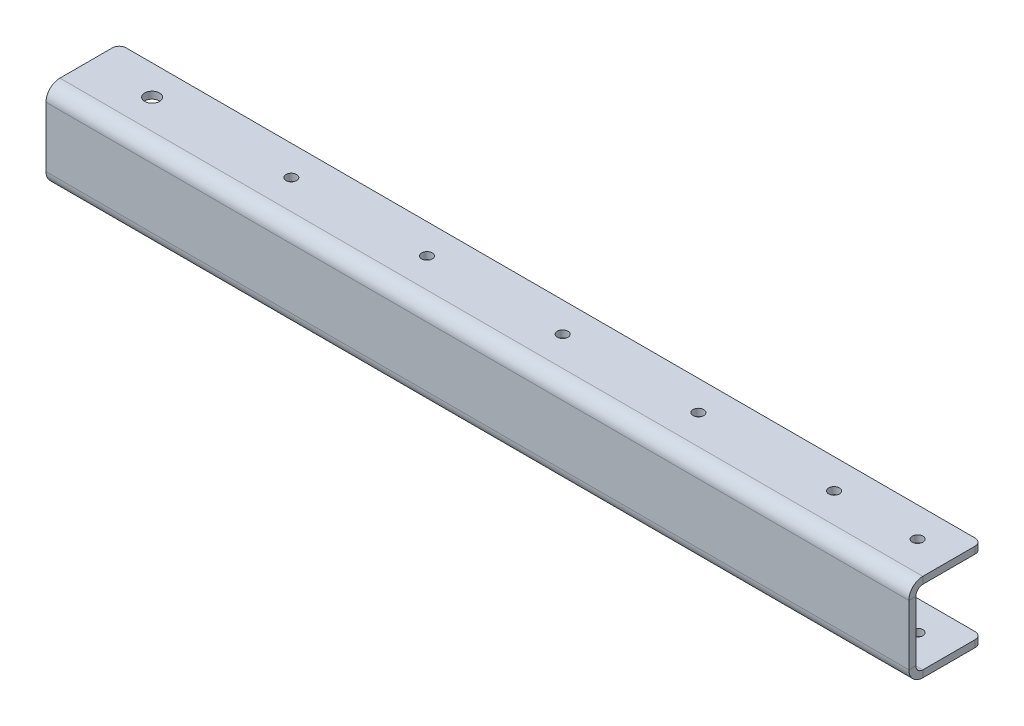
ISO-10303-21;
HEADER;
FILE_DESCRIPTION(('STEP AP214'),'2;1');
FILE_NAME('part.step','',(''),(''),'','','');
FILE_SCHEMA(('AUTOMOTIVE_DESIGN { 1 0 10303 214 1 1 1 1 }'));
ENDSEC;
DATA;
#1=APPLICATION_CONTEXT('core data for automotive mechanical design processes');
#2=APPLICATION_PROTOCOL_DEFINITION('international standard','automotive_design',2000,#1);
#3=PRODUCT_CONTEXT('',#1,'mechanical');
#4=PRODUCT('Part','Part','',(#3));
#5=PRODUCT_RELATED_PRODUCT_CATEGORY('part','',(#4));
#6=PRODUCT_DEFINITION_FORMATION('','',#4);
#7=PRODUCT_DEFINITION_CONTEXT('part definition',#1,'design');
#8=PRODUCT_DEFINITION('design','',#6,#7);
#9=PRODUCT_DEFINITION_SHAPE('','',#8);
#10=(LENGTH_UNIT() NAMED_UNIT(*) SI_UNIT(.MILLI.,.METRE.));
#11=(NAMED_UNIT(*) PLANE_ANGLE_UNIT() SI_UNIT($,.RADIAN.));
#12=(NAMED_UNIT(*) SI_UNIT($,.STERADIAN.) SOLID_ANGLE_UNIT());
#13=UNCERTAINTY_MEASURE_WITH_UNIT(LENGTH_MEASURE(1.E-05),#10,'distance_accuracy_value','');
#14=(GEOMETRIC_REPRESENTATION_CONTEXT(3) GLOBAL_UNCERTAINTY_ASSIGNED_CONTEXT((#13)) GLOBAL_UNIT_ASSIGNED_CONTEXT((#10,
#11,#12)) REPRESENTATION_CONTEXT('',''));
#15=CARTESIAN_POINT('',(0.,0.,0.));
#16=DIRECTION('',(0.,0.,1.));
#17=DIRECTION('',(1.,0.,0.));
#18=AXIS2_PLACEMENT_3D('',#15,#16,#17);
#19=CARTESIAN_POINT('',(393.7,0.,-3.175));
#20=DIRECTION('',(1.,0.,0.));
#21=DIRECTION('',(0.,0.,-1.));
#22=AXIS2_PLACEMENT_3D('',#19,#20,#21);
#23=PLANE('',#22);
#24=DIRECTION('',(0.,-1.,0.));
#25=VECTOR('',#24,1.);
#26=CARTESIAN_POINT('',(393.7,0.,-3.175));
#27=LINE('',#26,#25);
#28=CARTESIAN_POINT('',(393.7,0.,-3.175));
#29=VERTEX_POINT('',#28);
#30=CARTESIAN_POINT('',(393.7,-3.175,-3.175));
#31=VERTEX_POINT('',#30);
#32=EDGE_CURVE('E272',#29,#31,#27,.T.);
#33=ORIENTED_EDGE('',*,*,#32,.F.);
#34=CARTESIAN_POINT('',(393.7,3.175,-3.175));
#35=DIRECTION('',(1.,0.,0.));
#36=DIRECTION('',(0.,0.,-1.));
#37=AXIS2_PLACEMENT_3D('',#34,#35,#36);
#38=CIRCLE('',#37,3.175);
#39=CARTESIAN_POINT('',(393.7,3.175,0.));
#40=VERTEX_POINT('',#39);
#41=EDGE_CURVE('E201',#29,#40,#38,.F.);
#42=ORIENTED_EDGE('',*,*,#41,.T.);
#43=DIRECTION('',(0.,0.,-1.));
#44=VECTOR('',#43,1.);
#45=CARTESIAN_POINT('',(393.7,3.175,3.175));
#46=LINE('',#45,#44);
#47=CARTESIAN_POINT('',(393.7,3.175,3.175));
#48=VERTEX_POINT('',#47);
#49=EDGE_CURVE('E270',#48,#40,#46,.T.);
#50=ORIENTED_EDGE('',*,*,#49,.F.);
#51=CARTESIAN_POINT('',(393.7,3.175,-3.175));
#52=DIRECTION('',(1.,0.,0.));
#53=DIRECTION('',(0.,0.,-1.));
#54=AXIS2_PLACEMENT_3D('',#51,#52,#53);
#55=CIRCLE('',#54,6.35);
#56=EDGE_CURVE('E191',#31,#48,#55,.F.);
#57=ORIENTED_EDGE('',*,*,#56,.F.);
#58=EDGE_LOOP('',(#33,#42,#50,#57));
#59=FACE_BOUND('',#58,.T.);
#60=ADVANCED_FACE('F36',(#59),#23,.T.);
#61=CARTESIAN_POINT('',(393.7,3.175,3.175));
#62=DIRECTION('',(1.,0.,0.));
#63=DIRECTION('',(0.,0.,-1.));
#64=AXIS2_PLACEMENT_3D('',#61,#62,#63);
#65=PLANE('',#64);
#66=DIRECTION('',(0.,0.,-1.));
#67=VECTOR('',#66,1.);
#68=CARTESIAN_POINT('',(393.7,-3.175,0.));
#69=LINE('',#68,#67);
#70=CARTESIAN_POINT('',(393.7,-3.175,-27.051));
#71=VERTEX_POINT('',#70);
#72=EDGE_CURVE('E197',#71,#31,#69,.F.);
#73=ORIENTED_EDGE('',*,*,#72,.F.);
#74=DIRECTION('',(0.,-1.,0.));
#75=VECTOR('',#74,1.);
#76=CARTESIAN_POINT('',(393.7,3.175,-27.051));
#77=LINE('',#76,#75);
#78=CARTESIAN_POINT('',(393.7,0.,-27.051));
#79=VERTEX_POINT('',#78);
#80=EDGE_CURVE('E44',#71,#79,#77,.F.);
#81=ORIENTED_EDGE('',*,*,#80,.T.);
#82=DIRECTION('',(0.,0.,1.));
#83=VECTOR('',#82,1.);
#84=CARTESIAN_POINT('',(393.7,0.,0.));
#85=LINE('',#84,#83);
#86=EDGE_CURVE('E199',#79,#29,#85,.T.);
#87=ORIENTED_EDGE('',*,*,#86,.T.);
#88=ORIENTED_EDGE('',*,*,#32,.T.);
#89=EDGE_LOOP('',(#73,#81,#87,#88));
#90=FACE_BOUND('',#89,.T.);
#91=ADVANCED_FACE('F353',(#90),#65,.T.);
#92=CARTESIAN_POINT('',(0.,3.175,0.));
#93=DIRECTION('',(-1.,0.,0.));
#94=DIRECTION('',(0.,0.,1.));
#95=AXIS2_PLACEMENT_3D('',#92,#93,#94);
#96=PLANE('',#95);
#97=DIRECTION('',(0.,0.,1.));
#98=VECTOR('',#97,1.);
#99=CARTESIAN_POINT('',(0.,3.175,0.));
#100=LINE('',#99,#98);
#101=CARTESIAN_POINT('',(0.,3.175,0.));
#102=VERTEX_POINT('',#101);
#103=CARTESIAN_POINT('',(0.,3.175,3.175));
#104=VERTEX_POINT('',#103);
#105=EDGE_CURVE('E268',#102,#104,#100,.T.);
#106=ORIENTED_EDGE('',*,*,#105,.F.);
#107=CARTESIAN_POINT('',(0.,3.175,-3.175));
#108=DIRECTION('',(1.,0.,0.));
#109=DIRECTION('',(0.,0.,-1.));
#110=AXIS2_PLACEMENT_3D('',#107,#108,#109);
#111=CIRCLE('',#110,3.175);
#112=CARTESIAN_POINT('',(0.,0.,-3.175));
#113=VERTEX_POINT('',#112);
#114=EDGE_CURVE('E226',#113,#102,#111,.F.);
#115=ORIENTED_EDGE('',*,*,#114,.F.);
#116=DIRECTION('',(0.,1.,0.));
#117=VECTOR('',#116,1.);
#118=CARTESIAN_POINT('',(0.,-3.175,-3.175));
#119=LINE('',#118,#117);
#120=CARTESIAN_POINT('',(0.,-3.175,-3.175));
#121=VERTEX_POINT('',#120);
#122=EDGE_CURVE('E265',#121,#113,#119,.T.);
#123=ORIENTED_EDGE('',*,*,#122,.F.);
#124=CARTESIAN_POINT('',(0.,3.175,-3.175));
#125=DIRECTION('',(1.,0.,0.));
#126=DIRECTION('',(0.,0.,-1.));
#127=AXIS2_PLACEMENT_3D('',#124,#125,#126);
#128=CIRCLE('',#127,6.35);
#129=EDGE_CURVE('E219',#121,#104,#128,.F.);
#130=ORIENTED_EDGE('',*,*,#129,.T.);
#131=EDGE_LOOP('',(#106,#115,#123,#130));
#132=FACE_BOUND('',#131,.T.);
#133=ADVANCED_FACE('F490',(#132),#96,.T.);
#134=CARTESIAN_POINT('',(0.,-3.175,-3.175));
#135=DIRECTION('',(-1.,0.,0.));
#136=DIRECTION('',(0.,0.,1.));
#137=AXIS2_PLACEMENT_3D('',#134,#135,#136);
#138=PLANE('',#137);
#139=DIRECTION('',(0.,1.,0.));
#140=VECTOR('',#139,1.);
#141=CARTESIAN_POINT('',(0.,0.,0.));
#142=LINE('',#141,#140);
#143=CARTESIAN_POINT('',(0.,30.607,0.));
#144=VERTEX_POINT('',#143);
#145=EDGE_CURVE('E229',#102,#144,#142,.T.);
#146=ORIENTED_EDGE('',*,*,#145,.F.);
#147=ORIENTED_EDGE('',*,*,#105,.T.);
#148=DIRECTION('',(0.,1.,0.));
#149=VECTOR('',#148,1.);
#150=CARTESIAN_POINT('',(0.,0.,3.175));
#151=LINE('',#150,#149);
#152=CARTESIAN_POINT('',(0.,30.607,3.175));
#153=VERTEX_POINT('',#152);
#154=EDGE_CURVE('E216',#104,#153,#151,.T.);
#155=ORIENTED_EDGE('',*,*,#154,.T.);
#156=DIRECTION('',(0.,0.,-1.));
#157=VECTOR('',#156,1.);
#158=CARTESIAN_POINT('',(0.,30.607,3.175));
#159=LINE('',#158,#157);
#160=EDGE_CURVE('E261',#153,#144,#159,.T.);
#161=ORIENTED_EDGE('',*,*,#160,.T.);
#162=EDGE_LOOP('',(#146,#147,#155,#161));
#163=FACE_BOUND('',#162,.T.);
#164=ADVANCED_FACE('F518',(#163),#138,.T.);
#165=CARTESIAN_POINT('',(393.7,30.607,0.));
#166=DIRECTION('',(1.,0.,0.));
#167=DIRECTION('',(0.,0.,-1.));
#168=AXIS2_PLACEMENT_3D('',#165,#166,#167);
#169=PLANE('',#168);
#170=DIRECTION('',(0.,0.,1.));
#171=VECTOR('',#170,1.);
#172=CARTESIAN_POINT('',(393.7,30.607,0.));
#173=LINE('',#172,#171);
#174=CARTESIAN_POINT('',(393.7,30.607,0.));
#175=VERTEX_POINT('',#174);
#176=CARTESIAN_POINT('',(393.7,30.607,3.175));
#177=VERTEX_POINT('',#176);
#178=EDGE_CURVE('E162',#175,#177,#173,.T.);
#179=ORIENTED_EDGE('',*,*,#178,.F.);
#180=CARTESIAN_POINT('',(393.7,30.607,-3.175));
#181=DIRECTION('',(1.,0.,0.));
#182=DIRECTION('',(0.,0.,-1.));
#183=AXIS2_PLACEMENT_3D('',#180,#181,#182);
#184=CIRCLE('',#183,3.175);
#185=CARTESIAN_POINT('',(393.7,33.782,-3.175));
#186=VERTEX_POINT('',#185);
#187=EDGE_CURVE('E157',#175,#186,#184,.F.);
#188=ORIENTED_EDGE('',*,*,#187,.T.);
#189=DIRECTION('',(0.,-1.,0.));
#190=VECTOR('',#189,1.);
#191=CARTESIAN_POINT('',(393.7,36.957,-3.175));
#192=LINE('',#191,#190);
#193=CARTESIAN_POINT('',(393.7,36.957,-3.175));
#194=VERTEX_POINT('',#193);
#195=EDGE_CURVE('E150',#194,#186,#192,.T.);
#196=ORIENTED_EDGE('',*,*,#195,.F.);
#197=CARTESIAN_POINT('',(393.7,30.607,-3.175));
#198=DIRECTION('',(1.,0.,0.));
#199=DIRECTION('',(0.,0.,-1.));
#200=AXIS2_PLACEMENT_3D('',#197,#198,#199);
#201=CIRCLE('',#200,6.35);
#202=EDGE_CURVE('E154',#177,#194,#201,.F.);
#203=ORIENTED_EDGE('',*,*,#202,.F.);
#204=EDGE_LOOP('',(#179,#188,#196,#203));
#205=FACE_BOUND('',#204,.T.);
#206=ADVANCED_FACE('F152',(#205),#169,.T.);
#207=CARTESIAN_POINT('',(393.7,36.957,-3.175));
#208=DIRECTION('',(1.,0.,0.));
#209=DIRECTION('',(0.,0.,-1.));
#210=AXIS2_PLACEMENT_3D('',#207,#208,#209);
#211=PLANE('',#210);
#212=DIRECTION('',(0.,1.,0.));
#213=VECTOR('',#212,1.);
#214=CARTESIAN_POINT('',(393.7,0.,0.));
#215=LINE('',#214,#213);
#216=EDGE_CURVE('E204',#40,#175,#215,.T.);
#217=ORIENTED_EDGE('',*,*,#216,.T.);
#218=ORIENTED_EDGE('',*,*,#178,.T.);
#219=DIRECTION('',(0.,1.,0.));
#220=VECTOR('',#219,1.);
#221=CARTESIAN_POINT('',(393.7,0.,3.175));
#222=LINE('',#221,#220);
#223=EDGE_CURVE('E189',#48,#177,#222,.T.);
#224=ORIENTED_EDGE('',*,*,#223,.F.);
#225=ORIENTED_EDGE('',*,*,#49,.T.);
#226=EDGE_LOOP('',(#217,#218,#224,#225));
#227=FACE_BOUND('',#226,.T.);
#228=ADVANCED_FACE('F369',(#227),#211,.T.);
#229=CARTESIAN_POINT('',(0.,33.782,-3.175));
#230=DIRECTION('',(-1.,0.,0.));
#231=DIRECTION('',(0.,0.,1.));
#232=AXIS2_PLACEMENT_3D('',#229,#230,#231);
#233=PLANE('',#232);
#234=DIRECTION('',(0.,1.,0.));
#235=VECTOR('',#234,1.);
#236=CARTESIAN_POINT('',(0.,33.782,-3.175));
#237=LINE('',#236,#235);
#238=CARTESIAN_POINT('',(0.,33.782,-3.175));
#239=VERTEX_POINT('',#238);
#240=CARTESIAN_POINT('',(0.,36.957,-3.175));
#241=VERTEX_POINT('',#240);
#242=EDGE_CURVE('E163',#239,#241,#237,.T.);
#243=ORIENTED_EDGE('',*,*,#242,.F.);
#244=CARTESIAN_POINT('',(0.,30.607,-3.175));
#245=DIRECTION('',(1.,0.,0.));
#246=DIRECTION('',(0.,0.,-1.));
#247=AXIS2_PLACEMENT_3D('',#244,#245,#246);
#248=CIRCLE('',#247,3.175);
#249=EDGE_CURVE('E232',#144,#239,#248,.F.);
#250=ORIENTED_EDGE('',*,*,#249,.F.);
#251=ORIENTED_EDGE('',*,*,#160,.F.);
#252=CARTESIAN_POINT('',(0.,30.607,-3.175));
#253=DIRECTION('',(1.,0.,0.));
#254=DIRECTION('',(0.,0.,-1.));
#255=AXIS2_PLACEMENT_3D('',#252,#253,#254);
#256=CIRCLE('',#255,6.35);
#257=EDGE_CURVE('E214',#153,#241,#256,.F.);
#258=ORIENTED_EDGE('',*,*,#257,.T.);
#259=EDGE_LOOP('',(#243,#250,#251,#258));
#260=FACE_BOUND('',#259,.T.);
#261=ADVANCED_FACE('F516',(#260),#233,.T.);
#262=CARTESIAN_POINT('',(0.,30.607,3.175));
#263=DIRECTION('',(-1.,0.,0.));
#264=DIRECTION('',(0.,0.,1.));
#265=AXIS2_PLACEMENT_3D('',#262,#263,#264);
#266=PLANE('',#265);
#267=DIRECTION('',(0.,0.,-1.));
#268=VECTOR('',#267,1.);
#269=CARTESIAN_POINT('',(0.,36.957,0.));
#270=LINE('',#269,#268);
#271=CARTESIAN_POINT('',(0.,36.957,-27.051));
#272=VERTEX_POINT('',#271);
#273=EDGE_CURVE('E175',#241,#272,#270,.T.);
#274=ORIENTED_EDGE('',*,*,#273,.T.);
#275=DIRECTION('',(0.,-1.,0.));
#276=VECTOR('',#275,1.);
#277=CARTESIAN_POINT('',(0.,30.607,-27.051));
#278=LINE('',#277,#276);
#279=CARTESIAN_POINT('',(0.,33.782,-27.051));
#280=VERTEX_POINT('',#279);
#281=EDGE_CURVE('E275',#272,#280,#278,.T.);
#282=ORIENTED_EDGE('',*,*,#281,.T.);
#283=DIRECTION('',(0.,0.,-1.));
#284=VECTOR('',#283,1.);
#285=CARTESIAN_POINT('',(0.,33.782,0.));
#286=LINE('',#285,#284);
#287=EDGE_CURVE('E209',#239,#280,#286,.T.);
#288=ORIENTED_EDGE('',*,*,#287,.F.);
#289=ORIENTED_EDGE('',*,*,#242,.T.);
#290=EDGE_LOOP('',(#274,#282,#288,#289));
#291=FACE_BOUND('',#290,.T.);
#292=ADVANCED_FACE('F514',(#291),#266,.T.);
#293=CARTESIAN_POINT('',(393.7,33.782,0.));
#294=DIRECTION('',(0.,1.,0.));
#295=DIRECTION('',(0.,0.,1.));
#296=AXIS2_PLACEMENT_3D('',#293,#294,#295);
#297=PLANE('',#296);
#298=CARTESIAN_POINT('',(28.575,33.782,-16.66875));
#299=DIRECTION('',(0.,1.,0.));
#300=DIRECTION('',(0.,0.,1.));
#301=AXIS2_PLACEMENT_3D('',#298,#299,#300);
#302=CIRCLE('',#301,3.3782);
#303=CARTESIAN_POINT('',(28.575,33.782,-13.29055));
#304=VERTEX_POINT('',#303);
#305=EDGE_CURVE('E212',#304,#304,#302,.T.);
#306=ORIENTED_EDGE('',*,*,#305,.T.);
#307=EDGE_LOOP('',(#306));
#308=FACE_BOUND('',#307,.T.);
#309=CARTESIAN_POINT('',(277.8125,33.782,-16.66875));
#310=DIRECTION('',(0.,1.,0.));
#311=DIRECTION('',(0.,0.,1.));
#312=AXIS2_PLACEMENT_3D('',#309,#310,#311);
#313=CIRCLE('',#312,2.42569999999997);
#314=CARTESIAN_POINT('',(277.8125,33.782,-14.24305));
#315=VERTEX_POINT('',#314);
#316=EDGE_CURVE('E300',#315,#315,#313,.T.);
#317=ORIENTED_EDGE('',*,*,#316,.T.);
#318=EDGE_LOOP('',(#317));
#319=FACE_BOUND('',#318,.T.);
#320=CARTESIAN_POINT('',(215.9,33.782,-16.66875));
#321=DIRECTION('',(0.,1.,0.));
#322=DIRECTION('',(0.,0.,1.));
#323=AXIS2_PLACEMENT_3D('',#320,#321,#322);
#324=CIRCLE('',#323,2.4257);
#325=CARTESIAN_POINT('',(215.9,33.782,-14.24305));
#326=VERTEX_POINT('',#325);
#327=EDGE_CURVE('E296',#326,#326,#324,.T.);
#328=ORIENTED_EDGE('',*,*,#327,.T.);
#329=EDGE_LOOP('',(#328));
#330=FACE_BOUND('',#329,.T.);
#331=CARTESIAN_POINT('',(92.075,33.782,-16.66875));
#332=DIRECTION('',(0.,1.,0.));
#333=DIRECTION('',(0.,0.,1.));
#334=AXIS2_PLACEMENT_3D('',#331,#332,#333);
#335=CIRCLE('',#334,2.4257);
#336=CARTESIAN_POINT('',(92.075,33.782,-14.24305));
#337=VERTEX_POINT('',#336);
#338=EDGE_CURVE('E292',#337,#337,#335,.T.);
#339=ORIENTED_EDGE('',*,*,#338,.T.);
#340=EDGE_LOOP('',(#339));
#341=FACE_BOUND('',#340,.T.);
#342=CARTESIAN_POINT('',(339.725,33.782,-16.66875));
#343=DIRECTION('',(0.,1.,0.));
#344=DIRECTION('',(0.,0.,1.));
#345=AXIS2_PLACEMENT_3D('',#342,#343,#344);
#346=CIRCLE('',#345,2.42569999999997);
#347=CARTESIAN_POINT('',(339.725,33.782,-14.24305));
#348=VERTEX_POINT('',#347);
#349=EDGE_CURVE('E288',#348,#348,#346,.T.);
#350=ORIENTED_EDGE('',*,*,#349,.T.);
#351=EDGE_LOOP('',(#350));
#352=FACE_BOUND('',#351,.T.);
#353=CARTESIAN_POINT('',(377.825,33.782,-16.66875));
#354=DIRECTION('',(0.,1.,0.));
#355=DIRECTION('',(0.,0.,1.));
#356=AXIS2_PLACEMENT_3D('',#353,#354,#355);
#357=CIRCLE('',#356,2.42569999999997);
#358=CARTESIAN_POINT('',(377.825,33.782,-14.24305));
#359=VERTEX_POINT('',#358);
#360=EDGE_CURVE('E284',#359,#359,#357,.T.);
#361=ORIENTED_EDGE('',*,*,#360,.T.);
#362=EDGE_LOOP('',(#361));
#363=FACE_BOUND('',#362,.T.);
#364=CARTESIAN_POINT('',(153.9875,33.782,-16.66875));
#365=DIRECTION('',(0.,1.,0.));
#366=DIRECTION('',(0.,0.,1.));
#367=AXIS2_PLACEMENT_3D('',#364,#365,#366);
#368=CIRCLE('',#367,2.4257);
#369=CARTESIAN_POINT('',(153.9875,33.782,-14.24305));
#370=VERTEX_POINT('',#369);
#371=EDGE_CURVE('E279',#370,#370,#368,.T.);
#372=ORIENTED_EDGE('',*,*,#371,.T.);
#373=EDGE_LOOP('',(#372));
#374=FACE_BOUND('',#373,.T.);
#375=ORIENTED_EDGE('',*,*,#287,.T.);
#376=CARTESIAN_POINT('',(3.175,33.782,-27.051));
#377=DIRECTION('',(0.,1.,0.));
#378=DIRECTION('',(0.,0.,1.));
#379=AXIS2_PLACEMENT_3D('',#376,#377,#378);
#380=CIRCLE('',#379,3.175);
#381=CARTESIAN_POINT('',(3.17499999999998,33.782,-30.226));
#382=VERTEX_POINT('',#381);
#383=EDGE_CURVE('E308',#280,#382,#380,.F.);
#384=ORIENTED_EDGE('',*,*,#383,.T.);
#385=DIRECTION('',(-1.,0.,0.));
#386=VECTOR('',#385,1.);
#387=CARTESIAN_POINT('',(393.7,33.782,-30.226));
#388=LINE('',#387,#386);
#389=CARTESIAN_POINT('',(390.525,33.782,-30.226));
#390=VERTEX_POINT('',#389);
#391=EDGE_CURVE('E258',#390,#382,#388,.T.);
#392=ORIENTED_EDGE('',*,*,#391,.F.);
#393=CARTESIAN_POINT('',(390.525,33.782,-27.051));
#394=DIRECTION('',(0.,1.,0.));
#395=DIRECTION('',(0.,0.,1.));
#396=AXIS2_PLACEMENT_3D('',#393,#394,#395);
#397=CIRCLE('',#396,3.175);
#398=CARTESIAN_POINT('',(393.7,33.782,-27.051));
#399=VERTEX_POINT('',#398);
#400=EDGE_CURVE('E306',#390,#399,#397,.F.);
#401=ORIENTED_EDGE('',*,*,#400,.T.);
#402=DIRECTION('',(0.,0.,-1.));
#403=VECTOR('',#402,1.);
#404=CARTESIAN_POINT('',(393.7,33.782,0.));
#405=LINE('',#404,#403);
#406=EDGE_CURVE('E184',#186,#399,#405,.T.);
#407=ORIENTED_EDGE('',*,*,#406,.F.);
#408=DIRECTION('',(-1.,0.,0.));
#409=VECTOR('',#408,1.);
#410=CARTESIAN_POINT('',(393.7,33.782,-3.175));
#411=LINE('',#410,#409);
#412=EDGE_CURVE('E208',#186,#239,#411,.T.);
#413=ORIENTED_EDGE('',*,*,#412,.T.);
#414=EDGE_LOOP('',(#375,#384,#392,#401,#407,#413));
#415=FACE_BOUND('',#414,.T.);
#416=ADVANCED_FACE('F381',(#308,#319,#330,#341,#352,#363,#374,#415),#297,.F.);
#417=CARTESIAN_POINT('',(393.7,36.957,-30.226));
#418=DIRECTION('',(0.,0.,-1.));
#419=DIRECTION('',(-1.,0.,0.));
#420=AXIS2_PLACEMENT_3D('',#417,#418,#419);
#421=PLANE('',#420);
#422=ORIENTED_EDGE('',*,*,#391,.T.);
#423=DIRECTION('',(0.,-1.,0.));
#424=VECTOR('',#423,1.);
#425=CARTESIAN_POINT('',(3.17499999999998,36.957,-30.226));
#426=LINE('',#425,#424);
#427=CARTESIAN_POINT('',(3.17499999999998,36.957,-30.226));
#428=VERTEX_POINT('',#427);
#429=EDGE_CURVE('E313',#382,#428,#426,.F.);
#430=ORIENTED_EDGE('',*,*,#429,.T.);
#431=DIRECTION('',(-1.,0.,0.));
#432=VECTOR('',#431,1.);
#433=CARTESIAN_POINT('',(393.7,36.957,-30.226));
#434=LINE('',#433,#432);
#435=CARTESIAN_POINT('',(390.525,36.957,-30.226));
#436=VERTEX_POINT('',#435);
#437=EDGE_CURVE('E179',#436,#428,#434,.T.);
#438=ORIENTED_EDGE('',*,*,#437,.F.);
#439=DIRECTION('',(0.,-1.,0.));
#440=VECTOR('',#439,1.);
#441=CARTESIAN_POINT('',(390.525,36.957,-30.226));
#442=LINE('',#441,#440);
#443=EDGE_CURVE('E310',#436,#390,#442,.T.);
#444=ORIENTED_EDGE('',*,*,#443,.T.);
#445=EDGE_LOOP('',(#422,#430,#438,#444));
#446=FACE_BOUND('',#445,.T.);
#447=ADVANCED_FACE('F510',(#446),#421,.T.);
#448=CARTESIAN_POINT('',(393.7,36.957,0.));
#449=DIRECTION('',(0.,1.,0.));
#450=DIRECTION('',(0.,0.,1.));
#451=AXIS2_PLACEMENT_3D('',#448,#449,#450);
#452=PLANE('',#451);
#453=CARTESIAN_POINT('',(28.575,36.957,-16.66875));
#454=DIRECTION('',(0.,1.,0.));
#455=DIRECTION('',(0.,0.,1.));
#456=AXIS2_PLACEMENT_3D('',#453,#454,#455);
#457=CIRCLE('',#456,3.3782);
#458=CARTESIAN_POINT('',(28.575,36.957,-13.29055));
#459=VERTEX_POINT('',#458);
#460=EDGE_CURVE('E411',#459,#459,#457,.T.);
#461=ORIENTED_EDGE('',*,*,#460,.F.);
#462=EDGE_LOOP('',(#461));
#463=FACE_BOUND('',#462,.T.);
#464=CARTESIAN_POINT('',(277.8125,36.957,-16.66875));
#465=DIRECTION('',(0.,1.,0.));
#466=DIRECTION('',(0.,0.,1.));
#467=AXIS2_PLACEMENT_3D('',#464,#465,#466);
#468=CIRCLE('',#467,2.42569999999997);
#469=CARTESIAN_POINT('',(277.8125,36.957,-14.24305));
#470=VERTEX_POINT('',#469);
#471=EDGE_CURVE('E424',#470,#470,#468,.T.);
#472=ORIENTED_EDGE('',*,*,#471,.F.);
#473=EDGE_LOOP('',(#472));
#474=FACE_BOUND('',#473,.T.);
#475=CARTESIAN_POINT('',(215.9,36.957,-16.66875));
#476=DIRECTION('',(0.,1.,0.));
#477=DIRECTION('',(0.,0.,1.));
#478=AXIS2_PLACEMENT_3D('',#475,#476,#477);
#479=CIRCLE('',#478,2.4257);
#480=CARTESIAN_POINT('',(215.9,36.957,-14.24305));
#481=VERTEX_POINT('',#480);
#482=EDGE_CURVE('E430',#481,#481,#479,.T.);
#483=ORIENTED_EDGE('',*,*,#482,.F.);
#484=EDGE_LOOP('',(#483));
#485=FACE_BOUND('',#484,.T.);
#486=CARTESIAN_POINT('',(92.075,36.957,-16.66875));
#487=DIRECTION('',(0.,1.,0.));
#488=DIRECTION('',(0.,0.,1.));
#489=AXIS2_PLACEMENT_3D('',#486,#487,#488);
#490=CIRCLE('',#489,2.4257);
#491=CARTESIAN_POINT('',(92.075,36.957,-14.24305));
#492=VERTEX_POINT('',#491);
#493=EDGE_CURVE('E405',#492,#492,#490,.T.);
#494=ORIENTED_EDGE('',*,*,#493,.F.);
#495=EDGE_LOOP('',(#494));
#496=FACE_BOUND('',#495,.T.);
#497=CARTESIAN_POINT('',(339.725,36.957,-16.66875));
#498=DIRECTION('',(0.,1.,0.));
#499=DIRECTION('',(0.,0.,1.));
#500=AXIS2_PLACEMENT_3D('',#497,#498,#499);
#501=CIRCLE('',#500,2.42569999999997);
#502=CARTESIAN_POINT('',(339.725,36.957,-14.24305));
#503=VERTEX_POINT('',#502);
#504=EDGE_CURVE('E398',#503,#503,#501,.T.);
#505=ORIENTED_EDGE('',*,*,#504,.F.);
#506=EDGE_LOOP('',(#505));
#507=FACE_BOUND('',#506,.T.);
#508=CARTESIAN_POINT('',(377.825,36.957,-16.66875));
#509=DIRECTION('',(0.,1.,0.));
#510=DIRECTION('',(0.,0.,1.));
#511=AXIS2_PLACEMENT_3D('',#508,#509,#510);
#512=CIRCLE('',#511,2.42569999999997);
#513=CARTESIAN_POINT('',(377.825,36.957,-14.24305));
#514=VERTEX_POINT('',#513);
#515=EDGE_CURVE('E419',#514,#514,#512,.T.);
#516=ORIENTED_EDGE('',*,*,#515,.F.);
#517=EDGE_LOOP('',(#516));
#518=FACE_BOUND('',#517,.T.);
#519=CARTESIAN_POINT('',(153.9875,36.957,-16.66875));
#520=DIRECTION('',(0.,1.,0.));
#521=DIRECTION('',(0.,0.,1.));
#522=AXIS2_PLACEMENT_3D('',#519,#520,#521);
#523=CIRCLE('',#522,2.4257);
#524=CARTESIAN_POINT('',(153.9875,36.957,-14.24305));
#525=VERTEX_POINT('',#524);
#526=EDGE_CURVE('E412',#525,#525,#523,.T.);
#527=ORIENTED_EDGE('',*,*,#526,.F.);
#528=EDGE_LOOP('',(#527));
#529=FACE_BOUND('',#528,.T.);
#530=ORIENTED_EDGE('',*,*,#437,.T.);
#531=CARTESIAN_POINT('',(3.175,36.957,-27.051));
#532=DIRECTION('',(0.,1.,0.));
#533=DIRECTION('',(0.,0.,1.));
#534=AXIS2_PLACEMENT_3D('',#531,#532,#533);
#535=CIRCLE('',#534,3.175);
#536=EDGE_CURVE('E317',#428,#272,#535,.T.);
#537=ORIENTED_EDGE('',*,*,#536,.T.);
#538=ORIENTED_EDGE('',*,*,#273,.F.);
#539=DIRECTION('',(-1.,0.,0.));
#540=VECTOR('',#539,1.);
#541=CARTESIAN_POINT('',(393.7,36.957,-3.175));
#542=LINE('',#541,#540);
#543=EDGE_CURVE('E169',#194,#241,#542,.T.);
#544=ORIENTED_EDGE('',*,*,#543,.F.);
#545=DIRECTION('',(0.,0.,-1.));
#546=VECTOR('',#545,1.);
#547=CARTESIAN_POINT('',(393.7,36.957,0.));
#548=LINE('',#547,#546);
#549=CARTESIAN_POINT('',(393.7,36.957,-27.051));
#550=VERTEX_POINT('',#549);
#551=EDGE_CURVE('E172',#194,#550,#548,.T.);
#552=ORIENTED_EDGE('',*,*,#551,.T.);
#553=CARTESIAN_POINT('',(390.525,36.957,-27.051));
#554=DIRECTION('',(0.,1.,0.));
#555=DIRECTION('',(0.,0.,1.));
#556=AXIS2_PLACEMENT_3D('',#553,#554,#555);
#557=CIRCLE('',#556,3.175);
#558=EDGE_CURVE('E315',#550,#436,#557,.T.);
#559=ORIENTED_EDGE('',*,*,#558,.T.);
#560=EDGE_LOOP('',(#530,#537,#538,#544,#552,#559));
#561=FACE_BOUND('',#560,.T.);
#562=ADVANCED_FACE('F171',(#463,#474,#485,#496,#507,#518,#529,#561),#452,.T.);
#563=CARTESIAN_POINT('',(393.7,30.607,-3.175));
#564=DIRECTION('',(-1.,0.,0.));
#565=DIRECTION('',(0.,0.,1.));
#566=AXIS2_PLACEMENT_3D('',#563,#564,#565);
#567=CYLINDRICAL_SURFACE('',#566,6.35);
#568=ORIENTED_EDGE('',*,*,#257,.F.);
#569=DIRECTION('',(-1.,0.,0.));
#570=VECTOR('',#569,1.);
#571=CARTESIAN_POINT('',(393.7,30.607,3.175));
#572=LINE('',#571,#570);
#573=EDGE_CURVE('E180',#177,#153,#572,.T.);
#574=ORIENTED_EDGE('',*,*,#573,.F.);
#575=ORIENTED_EDGE('',*,*,#202,.T.);
#576=ORIENTED_EDGE('',*,*,#543,.T.);
#577=EDGE_LOOP('',(#568,#574,#575,#576));
#578=FACE_BOUND('',#577,.T.);
#579=ADVANCED_FACE('F187',(#578),#567,.T.);
#580=CARTESIAN_POINT('',(393.7,0.,3.175));
#581=DIRECTION('',(0.,0.,1.));
#582=DIRECTION('',(1.,0.,0.));
#583=AXIS2_PLACEMENT_3D('',#580,#581,#582);
#584=PLANE('',#583);
#585=ORIENTED_EDGE('',*,*,#154,.F.);
#586=DIRECTION('',(-1.,0.,0.));
#587=VECTOR('',#586,1.);
#588=CARTESIAN_POINT('',(393.7,3.175,3.175));
#589=LINE('',#588,#587);
#590=EDGE_CURVE('E253',#48,#104,#589,.T.);
#591=ORIENTED_EDGE('',*,*,#590,.F.);
#592=ORIENTED_EDGE('',*,*,#223,.T.);
#593=ORIENTED_EDGE('',*,*,#573,.T.);
#594=EDGE_LOOP('',(#585,#591,#592,#593));
#595=FACE_BOUND('',#594,.T.);
#596=ADVANCED_FACE('F368',(#595),#584,.T.);
#597=CARTESIAN_POINT('',(393.7,3.175,-3.175));
#598=DIRECTION('',(-1.,0.,0.));
#599=DIRECTION('',(0.,0.,1.));
#600=AXIS2_PLACEMENT_3D('',#597,#598,#599);
#601=CYLINDRICAL_SURFACE('',#600,6.35);
#602=ORIENTED_EDGE('',*,*,#129,.F.);
#603=DIRECTION('',(-1.,0.,0.));
#604=VECTOR('',#603,1.);
#605=CARTESIAN_POINT('',(393.7,-3.175,-3.175));
#606=LINE('',#605,#604);
#607=EDGE_CURVE('E250',#31,#121,#606,.T.);
#608=ORIENTED_EDGE('',*,*,#607,.F.);
#609=ORIENTED_EDGE('',*,*,#56,.T.);
#610=ORIENTED_EDGE('',*,*,#590,.T.);
#611=EDGE_LOOP('',(#602,#608,#609,#610));
#612=FACE_BOUND('',#611,.T.);
#613=ADVANCED_FACE('F360',(#612),#601,.T.);
#614=CARTESIAN_POINT('',(393.7,-3.175,0.));
#615=DIRECTION('',(0.,-1.,0.));
#616=DIRECTION('',(0.,0.,-1.));
#617=AXIS2_PLACEMENT_3D('',#614,#615,#616);
#618=PLANE('',#617);
#619=CARTESIAN_POINT('',(28.575,-3.175,-16.66875));
#620=DIRECTION('',(0.,1.,0.));
#621=DIRECTION('',(0.,0.,1.));
#622=AXIS2_PLACEMENT_3D('',#619,#620,#621);
#623=CIRCLE('',#622,3.3782);
#624=CARTESIAN_POINT('',(28.575,-3.175,-13.29055));
#625=VERTEX_POINT('',#624);
#626=EDGE_CURVE('E280',#625,#625,#623,.T.);
#627=ORIENTED_EDGE('',*,*,#626,.T.);
#628=EDGE_LOOP('',(#627));
#629=FACE_BOUND('',#628,.T.);
#630=CARTESIAN_POINT('',(277.8125,-3.175,-16.66875));
#631=DIRECTION('',(0.,1.,0.));
#632=DIRECTION('',(0.,0.,1.));
#633=AXIS2_PLACEMENT_3D('',#630,#631,#632);
#634=CIRCLE('',#633,2.42569999999997);
#635=CARTESIAN_POINT('',(277.8125,-3.175,-14.24305));
#636=VERTEX_POINT('',#635);
#637=EDGE_CURVE('E427',#636,#636,#634,.T.);
#638=ORIENTED_EDGE('',*,*,#637,.T.);
#639=EDGE_LOOP('',(#638));
#640=FACE_BOUND('',#639,.T.);
#641=CARTESIAN_POINT('',(215.9,-3.175,-16.66875));
#642=DIRECTION('',(0.,1.,0.));
#643=DIRECTION('',(0.,0.,1.));
#644=AXIS2_PLACEMENT_3D('',#641,#642,#643);
#645=CIRCLE('',#644,2.4257);
#646=CARTESIAN_POINT('',(215.9,-3.175,-14.24305));
#647=VERTEX_POINT('',#646);
#648=EDGE_CURVE('E416',#647,#647,#645,.T.);
#649=ORIENTED_EDGE('',*,*,#648,.T.);
#650=EDGE_LOOP('',(#649));
#651=FACE_BOUND('',#650,.T.);
#652=CARTESIAN_POINT('',(92.075,-3.175,-16.66875));
#653=DIRECTION('',(0.,1.,0.));
#654=DIRECTION('',(0.,0.,1.));
#655=AXIS2_PLACEMENT_3D('',#652,#653,#654);
#656=CIRCLE('',#655,2.4257);
#657=CARTESIAN_POINT('',(92.075,-3.175,-14.24305));
#658=VERTEX_POINT('',#657);
#659=EDGE_CURVE('E408',#658,#658,#656,.T.);
#660=ORIENTED_EDGE('',*,*,#659,.T.);
#661=EDGE_LOOP('',(#660));
#662=FACE_BOUND('',#661,.T.);
#663=CARTESIAN_POINT('',(339.725,-3.175,-16.66875));
#664=DIRECTION('',(0.,1.,0.));
#665=DIRECTION('',(0.,0.,1.));
#666=AXIS2_PLACEMENT_3D('',#663,#664,#665);
#667=CIRCLE('',#666,2.42569999999997);
#668=CARTESIAN_POINT('',(339.725,-3.175,-14.24305));
#669=VERTEX_POINT('',#668);
#670=EDGE_CURVE('E401',#669,#669,#667,.T.);
#671=ORIENTED_EDGE('',*,*,#670,.T.);
#672=EDGE_LOOP('',(#671));
#673=FACE_BOUND('',#672,.T.);
#674=CARTESIAN_POINT('',(377.825,-3.175,-16.66875));
#675=DIRECTION('',(0.,1.,0.));
#676=DIRECTION('',(0.,0.,1.));
#677=AXIS2_PLACEMENT_3D('',#674,#675,#676);
#678=CIRCLE('',#677,2.42569999999997);
#679=CARTESIAN_POINT('',(377.825,-3.175,-14.24305));
#680=VERTEX_POINT('',#679);
#681=EDGE_CURVE('E402',#680,#680,#678,.T.);
#682=ORIENTED_EDGE('',*,*,#681,.T.);
#683=EDGE_LOOP('',(#682));
#684=FACE_BOUND('',#683,.T.);
#685=CARTESIAN_POINT('',(153.9875,-3.175,-16.66875));
#686=DIRECTION('',(0.,1.,0.));
#687=DIRECTION('',(0.,0.,1.));
#688=AXIS2_PLACEMENT_3D('',#685,#686,#687);
#689=CIRCLE('',#688,2.4257);
#690=CARTESIAN_POINT('',(153.9875,-3.175,-14.24305));
#691=VERTEX_POINT('',#690);
#692=EDGE_CURVE('E415',#691,#691,#689,.T.);
#693=ORIENTED_EDGE('',*,*,#692,.T.);
#694=EDGE_LOOP('',(#693));
#695=FACE_BOUND('',#694,.T.);
#696=DIRECTION('',(0.,0.,-1.));
#697=VECTOR('',#696,1.);
#698=CARTESIAN_POINT('',(0.,-3.175,0.));
#699=LINE('',#698,#697);
#700=CARTESIAN_POINT('',(0.,-3.175,-27.051));
#701=VERTEX_POINT('',#700);
#702=EDGE_CURVE('E222',#701,#121,#699,.F.);
#703=ORIENTED_EDGE('',*,*,#702,.F.);
#704=CARTESIAN_POINT('',(3.175,-3.175,-27.051));
#705=DIRECTION('',(0.,-1.,0.));
#706=DIRECTION('',(0.,0.,-1.));
#707=AXIS2_PLACEMENT_3D('',#704,#705,#706);
#708=CIRCLE('',#707,3.175);
#709=CARTESIAN_POINT('',(3.17499999999998,-3.175,-30.226));
#710=VERTEX_POINT('',#709);
#711=EDGE_CURVE('E324',#701,#710,#708,.T.);
#712=ORIENTED_EDGE('',*,*,#711,.T.);
#713=DIRECTION('',(-1.,0.,0.));
#714=VECTOR('',#713,1.);
#715=CARTESIAN_POINT('',(393.7,-3.175,-30.226));
#716=LINE('',#715,#714);
#717=CARTESIAN_POINT('',(390.525,-3.175,-30.226));
#718=VERTEX_POINT('',#717);
#719=EDGE_CURVE('E248',#718,#710,#716,.T.);
#720=ORIENTED_EDGE('',*,*,#719,.F.);
#721=CARTESIAN_POINT('',(390.525,-3.175,-27.051));
#722=DIRECTION('',(0.,-1.,0.));
#723=DIRECTION('',(0.,0.,-1.));
#724=AXIS2_PLACEMENT_3D('',#721,#722,#723);
#725=CIRCLE('',#724,3.175);
#726=EDGE_CURVE('E322',#718,#71,#725,.T.);
#727=ORIENTED_EDGE('',*,*,#726,.T.);
#728=ORIENTED_EDGE('',*,*,#72,.T.);
#729=ORIENTED_EDGE('',*,*,#607,.T.);
#730=EDGE_LOOP('',(#703,#712,#720,#727,#728,#729));
#731=FACE_BOUND('',#730,.T.);
#732=ADVANCED_FACE('F347',(#629,#640,#651,#662,#673,#684,#695,#731),#618,.T.);
#733=CARTESIAN_POINT('',(393.7,0.,-30.226));
#734=DIRECTION('',(0.,0.,-1.));
#735=DIRECTION('',(-1.,0.,0.));
#736=AXIS2_PLACEMENT_3D('',#733,#734,#735);
#737=PLANE('',#736);
#738=ORIENTED_EDGE('',*,*,#719,.T.);
#739=DIRECTION('',(0.,-1.,0.));
#740=VECTOR('',#739,1.);
#741=CARTESIAN_POINT('',(3.175,0.,-30.226));
#742=LINE('',#741,#740);
#743=CARTESIAN_POINT('',(3.17499999999998,0.,-30.226));
#744=VERTEX_POINT('',#743);
#745=EDGE_CURVE('E58',#710,#744,#742,.F.);
#746=ORIENTED_EDGE('',*,*,#745,.T.);
#747=DIRECTION('',(-1.,0.,0.));
#748=VECTOR('',#747,1.);
#749=CARTESIAN_POINT('',(393.7,0.,-30.226));
#750=LINE('',#749,#748);
#751=CARTESIAN_POINT('',(390.525,0.,-30.226));
#752=VERTEX_POINT('',#751);
#753=EDGE_CURVE('E246',#752,#744,#750,.T.);
#754=ORIENTED_EDGE('',*,*,#753,.F.);
#755=DIRECTION('',(0.,-1.,0.));
#756=VECTOR('',#755,1.);
#757=CARTESIAN_POINT('',(390.525,0.,-30.226));
#758=LINE('',#757,#756);
#759=EDGE_CURVE('E326',#752,#718,#758,.T.);
#760=ORIENTED_EDGE('',*,*,#759,.T.);
#761=EDGE_LOOP('',(#738,#746,#754,#760));
#762=FACE_BOUND('',#761,.T.);
#763=ADVANCED_FACE('F348',(#762),#737,.T.);
#764=CARTESIAN_POINT('',(393.7,0.,0.));
#765=DIRECTION('',(0.,-1.,0.));
#766=DIRECTION('',(0.,0.,-1.));
#767=AXIS2_PLACEMENT_3D('',#764,#765,#766);
#768=PLANE('',#767);
#769=CARTESIAN_POINT('',(28.575,0.,-16.66875));
#770=DIRECTION('',(0.,-1.,0.));
#771=DIRECTION('',(0.,0.,-1.));
#772=AXIS2_PLACEMENT_3D('',#769,#770,#771);
#773=CIRCLE('',#772,3.3782);
#774=CARTESIAN_POINT('',(28.575,0.,-20.04695));
#775=VERTEX_POINT('',#774);
#776=EDGE_CURVE('E301',#775,#775,#773,.T.);
#777=ORIENTED_EDGE('',*,*,#776,.T.);
#778=EDGE_LOOP('',(#777));
#779=FACE_BOUND('',#778,.T.);
#780=CARTESIAN_POINT('',(277.8125,0.,-16.66875));
#781=DIRECTION('',(0.,-1.,0.));
#782=DIRECTION('',(0.,0.,-1.));
#783=AXIS2_PLACEMENT_3D('',#780,#781,#782);
#784=CIRCLE('',#783,2.42569999999997);
#785=CARTESIAN_POINT('',(277.8125,0.,-19.09445));
#786=VERTEX_POINT('',#785);
#787=EDGE_CURVE('E297',#786,#786,#784,.T.);
#788=ORIENTED_EDGE('',*,*,#787,.T.);
#789=EDGE_LOOP('',(#788));
#790=FACE_BOUND('',#789,.T.);
#791=CARTESIAN_POINT('',(215.9,0.,-16.66875));
#792=DIRECTION('',(0.,-1.,0.));
#793=DIRECTION('',(0.,0.,-1.));
#794=AXIS2_PLACEMENT_3D('',#791,#792,#793);
#795=CIRCLE('',#794,2.4257);
#796=CARTESIAN_POINT('',(215.9,0.,-19.09445));
#797=VERTEX_POINT('',#796);
#798=EDGE_CURVE('E293',#797,#797,#795,.T.);
#799=ORIENTED_EDGE('',*,*,#798,.T.);
#800=EDGE_LOOP('',(#799));
#801=FACE_BOUND('',#800,.T.);
#802=CARTESIAN_POINT('',(92.075,0.,-16.66875));
#803=DIRECTION('',(0.,-1.,0.));
#804=DIRECTION('',(0.,0.,-1.));
#805=AXIS2_PLACEMENT_3D('',#802,#803,#804);
#806=CIRCLE('',#805,2.4257);
#807=CARTESIAN_POINT('',(92.075,0.,-19.09445));
#808=VERTEX_POINT('',#807);
#809=EDGE_CURVE('E289',#808,#808,#806,.T.);
#810=ORIENTED_EDGE('',*,*,#809,.T.);
#811=EDGE_LOOP('',(#810));
#812=FACE_BOUND('',#811,.T.);
#813=CARTESIAN_POINT('',(339.725,0.,-16.66875));
#814=DIRECTION('',(0.,-1.,0.));
#815=DIRECTION('',(0.,0.,-1.));
#816=AXIS2_PLACEMENT_3D('',#813,#814,#815);
#817=CIRCLE('',#816,2.42569999999997);
#818=CARTESIAN_POINT('',(339.725,0.,-19.09445));
#819=VERTEX_POINT('',#818);
#820=EDGE_CURVE('E285',#819,#819,#817,.T.);
#821=ORIENTED_EDGE('',*,*,#820,.T.);
#822=EDGE_LOOP('',(#821));
#823=FACE_BOUND('',#822,.T.);
#824=CARTESIAN_POINT('',(377.825,0.,-16.66875));
#825=DIRECTION('',(0.,-1.,0.));
#826=DIRECTION('',(0.,0.,-1.));
#827=AXIS2_PLACEMENT_3D('',#824,#825,#826);
#828=CIRCLE('',#827,2.42569999999997);
#829=CARTESIAN_POINT('',(377.825,0.,-19.09445));
#830=VERTEX_POINT('',#829);
#831=EDGE_CURVE('E281',#830,#830,#828,.T.);
#832=ORIENTED_EDGE('',*,*,#831,.T.);
#833=EDGE_LOOP('',(#832));
#834=FACE_BOUND('',#833,.T.);
#835=CARTESIAN_POINT('',(153.9875,0.,-16.66875));
#836=DIRECTION('',(0.,-1.,0.));
#837=DIRECTION('',(0.,0.,-1.));
#838=AXIS2_PLACEMENT_3D('',#835,#836,#837);
#839=CIRCLE('',#838,2.4257);
#840=CARTESIAN_POINT('',(153.9875,0.,-19.09445));
#841=VERTEX_POINT('',#840);
#842=EDGE_CURVE('E276',#841,#841,#839,.T.);
#843=ORIENTED_EDGE('',*,*,#842,.T.);
#844=EDGE_LOOP('',(#843));
#845=FACE_BOUND('',#844,.T.);
#846=ORIENTED_EDGE('',*,*,#753,.T.);
#847=CARTESIAN_POINT('',(3.175,0.,-27.051));
#848=DIRECTION('',(0.,-1.,0.));
#849=DIRECTION('',(0.,0.,-1.));
#850=AXIS2_PLACEMENT_3D('',#847,#848,#849);
#851=CIRCLE('',#850,3.175);
#852=CARTESIAN_POINT('',(0.,0.,-27.051));
#853=VERTEX_POINT('',#852);
#854=EDGE_CURVE('E332',#744,#853,#851,.F.);
#855=ORIENTED_EDGE('',*,*,#854,.T.);
#856=DIRECTION('',(0.,0.,1.));
#857=VECTOR('',#856,1.);
#858=CARTESIAN_POINT('',(0.,0.,0.));
#859=LINE('',#858,#857);
#860=EDGE_CURVE('E224',#853,#113,#859,.T.);
#861=ORIENTED_EDGE('',*,*,#860,.T.);
#862=DIRECTION('',(-1.,0.,0.));
#863=VECTOR('',#862,1.);
#864=CARTESIAN_POINT('',(393.7,0.,-3.175));
#865=LINE('',#864,#863);
#866=EDGE_CURVE('E243',#29,#113,#865,.T.);
#867=ORIENTED_EDGE('',*,*,#866,.F.);
#868=ORIENTED_EDGE('',*,*,#86,.F.);
#869=CARTESIAN_POINT('',(390.525,0.,-27.051));
#870=DIRECTION('',(0.,-1.,0.));
#871=DIRECTION('',(0.,0.,-1.));
#872=AXIS2_PLACEMENT_3D('',#869,#870,#871);
#873=CIRCLE('',#872,3.175);
#874=EDGE_CURVE('E330',#79,#752,#873,.F.);
#875=ORIENTED_EDGE('',*,*,#874,.T.);
#876=EDGE_LOOP('',(#846,#855,#861,#867,#868,#875));
#877=FACE_BOUND('',#876,.T.);
#878=ADVANCED_FACE('F336',(#779,#790,#801,#812,#823,#834,#845,#877),#768,.F.);
#879=CARTESIAN_POINT('',(393.7,3.175,-3.175));
#880=DIRECTION('',(-1.,0.,0.));
#881=DIRECTION('',(0.,0.,1.));
#882=AXIS2_PLACEMENT_3D('',#879,#880,#881);
#883=CYLINDRICAL_SURFACE('',#882,3.175);
#884=ORIENTED_EDGE('',*,*,#114,.T.);
#885=DIRECTION('',(-1.,0.,0.));
#886=VECTOR('',#885,1.);
#887=CARTESIAN_POINT('',(393.7,3.175,0.));
#888=LINE('',#887,#886);
#889=EDGE_CURVE('E240',#40,#102,#888,.T.);
#890=ORIENTED_EDGE('',*,*,#889,.F.);
#891=ORIENTED_EDGE('',*,*,#41,.F.);
#892=ORIENTED_EDGE('',*,*,#866,.T.);
#893=EDGE_LOOP('',(#884,#890,#891,#892));
#894=FACE_BOUND('',#893,.T.);
#895=ADVANCED_FACE('F453',(#894),#883,.F.);
#896=CARTESIAN_POINT('',(393.7,0.,0.));
#897=DIRECTION('',(0.,0.,1.));
#898=DIRECTION('',(1.,0.,0.));
#899=AXIS2_PLACEMENT_3D('',#896,#897,#898);
#900=PLANE('',#899);
#901=ORIENTED_EDGE('',*,*,#145,.T.);
#902=DIRECTION('',(-1.,0.,0.));
#903=VECTOR('',#902,1.);
#904=CARTESIAN_POINT('',(393.7,30.607,0.));
#905=LINE('',#904,#903);
#906=EDGE_CURVE('E237',#175,#144,#905,.T.);
#907=ORIENTED_EDGE('',*,*,#906,.F.);
#908=ORIENTED_EDGE('',*,*,#216,.F.);
#909=ORIENTED_EDGE('',*,*,#889,.T.);
#910=EDGE_LOOP('',(#901,#907,#908,#909));
#911=FACE_BOUND('',#910,.T.);
#912=ADVANCED_FACE('F373',(#911),#900,.F.);
#913=CARTESIAN_POINT('',(393.7,30.607,-3.175));
#914=DIRECTION('',(-1.,0.,0.));
#915=DIRECTION('',(0.,0.,1.));
#916=AXIS2_PLACEMENT_3D('',#913,#914,#915);
#917=CYLINDRICAL_SURFACE('',#916,3.175);
#918=ORIENTED_EDGE('',*,*,#249,.T.);
#919=ORIENTED_EDGE('',*,*,#412,.F.);
#920=ORIENTED_EDGE('',*,*,#187,.F.);
#921=ORIENTED_EDGE('',*,*,#906,.T.);
#922=EDGE_LOOP('',(#918,#919,#920,#921));
#923=FACE_BOUND('',#922,.T.);
#924=ADVANCED_FACE('F377',(#923),#917,.F.);
#925=CARTESIAN_POINT('',(393.7,30.607,-3.175));
#926=DIRECTION('',(1.,0.,0.));
#927=DIRECTION('',(0.,0.,-1.));
#928=AXIS2_PLACEMENT_3D('',#925,#926,#927);
#929=PLANE('',#928);
#930=ORIENTED_EDGE('',*,*,#406,.T.);
#931=DIRECTION('',(0.,-1.,0.));
#932=VECTOR('',#931,1.);
#933=CARTESIAN_POINT('',(393.7,30.607,-27.051));
#934=LINE('',#933,#932);
#935=EDGE_CURVE('E11',#399,#550,#934,.F.);
#936=ORIENTED_EDGE('',*,*,#935,.T.);
#937=ORIENTED_EDGE('',*,*,#551,.F.);
#938=ORIENTED_EDGE('',*,*,#195,.T.);
#939=EDGE_LOOP('',(#930,#936,#937,#938));
#940=FACE_BOUND('',#939,.T.);
#941=ADVANCED_FACE('F182',(#940),#929,.T.);
#942=CARTESIAN_POINT('',(0.,30.607,-3.175));
#943=DIRECTION('',(1.,0.,0.));
#944=DIRECTION('',(0.,0.,-1.));
#945=AXIS2_PLACEMENT_3D('',#942,#943,#944);
#946=PLANE('',#945);
#947=ORIENTED_EDGE('',*,*,#860,.F.);
#948=DIRECTION('',(0.,-1.,0.));
#949=VECTOR('',#948,1.);
#950=CARTESIAN_POINT('',(0.,-3.175,-27.051));
#951=LINE('',#950,#949);
#952=EDGE_CURVE('E319',#853,#701,#951,.T.);
#953=ORIENTED_EDGE('',*,*,#952,.T.);
#954=ORIENTED_EDGE('',*,*,#702,.T.);
#955=ORIENTED_EDGE('',*,*,#122,.T.);
#956=EDGE_LOOP('',(#947,#953,#954,#955));
#957=FACE_BOUND('',#956,.T.);
#958=ADVANCED_FACE('F341',(#957),#946,.F.);
#959=CARTESIAN_POINT('',(153.9875,-3.175,-16.66875));
#960=DIRECTION('',(0.,1.,0.));
#961=DIRECTION('',(0.,0.,1.));
#962=AXIS2_PLACEMENT_3D('',#959,#960,#961);
#963=CYLINDRICAL_SURFACE('',#962,2.4257);
#964=ORIENTED_EDGE('',*,*,#692,.F.);
#965=EDGE_LOOP('',(#964));
#966=FACE_BOUND('',#965,.T.);
#967=ORIENTED_EDGE('',*,*,#842,.F.);
#968=EDGE_LOOP('',(#967));
#969=FACE_BOUND('',#968,.T.);
#970=ADVANCED_FACE('F467',(#966,#969),#963,.F.);
#971=CARTESIAN_POINT('',(377.825,-3.175,-16.66875));
#972=DIRECTION('',(0.,1.,0.));
#973=DIRECTION('',(0.,0.,1.));
#974=AXIS2_PLACEMENT_3D('',#971,#972,#973);
#975=CYLINDRICAL_SURFACE('',#974,2.42569999999997);
#976=ORIENTED_EDGE('',*,*,#681,.F.);
#977=EDGE_LOOP('',(#976));
#978=FACE_BOUND('',#977,.T.);
#979=ORIENTED_EDGE('',*,*,#831,.F.);
#980=EDGE_LOOP('',(#979));
#981=FACE_BOUND('',#980,.T.);
#982=ADVANCED_FACE('F469',(#978,#981),#975,.F.);
#983=CARTESIAN_POINT('',(339.725,-3.175,-16.66875));
#984=DIRECTION('',(0.,1.,0.));
#985=DIRECTION('',(0.,0.,1.));
#986=AXIS2_PLACEMENT_3D('',#983,#984,#985);
#987=CYLINDRICAL_SURFACE('',#986,2.42569999999997);
#988=ORIENTED_EDGE('',*,*,#670,.F.);
#989=EDGE_LOOP('',(#988));
#990=FACE_BOUND('',#989,.T.);
#991=ORIENTED_EDGE('',*,*,#820,.F.);
#992=EDGE_LOOP('',(#991));
#993=FACE_BOUND('',#992,.T.);
#994=ADVANCED_FACE('F476',(#990,#993),#987,.F.);
#995=CARTESIAN_POINT('',(92.075,-3.175,-16.66875));
#996=DIRECTION('',(0.,1.,0.));
#997=DIRECTION('',(0.,0.,1.));
#998=AXIS2_PLACEMENT_3D('',#995,#996,#997);
#999=CYLINDRICAL_SURFACE('',#998,2.4257);
#1000=ORIENTED_EDGE('',*,*,#659,.F.);
#1001=EDGE_LOOP('',(#1000));
#1002=FACE_BOUND('',#1001,.T.);
#1003=ORIENTED_EDGE('',*,*,#809,.F.);
#1004=EDGE_LOOP('',(#1003));
#1005=FACE_BOUND('',#1004,.T.);
#1006=ADVANCED_FACE('F693',(#1002,#1005),#999,.F.);
#1007=CARTESIAN_POINT('',(215.9,-3.175,-16.66875));
#1008=DIRECTION('',(0.,1.,0.));
#1009=DIRECTION('',(0.,0.,1.));
#1010=AXIS2_PLACEMENT_3D('',#1007,#1008,#1009);
#1011=CYLINDRICAL_SURFACE('',#1010,2.4257);
#1012=ORIENTED_EDGE('',*,*,#648,.F.);
#1013=EDGE_LOOP('',(#1012));
#1014=FACE_BOUND('',#1013,.T.);
#1015=ORIENTED_EDGE('',*,*,#798,.F.);
#1016=EDGE_LOOP('',(#1015));
#1017=FACE_BOUND('',#1016,.T.);
#1018=ADVANCED_FACE('F685',(#1014,#1017),#1011,.F.);
#1019=CARTESIAN_POINT('',(277.8125,-3.175,-16.66875));
#1020=DIRECTION('',(0.,1.,0.));
#1021=DIRECTION('',(0.,0.,1.));
#1022=AXIS2_PLACEMENT_3D('',#1019,#1020,#1021);
#1023=CYLINDRICAL_SURFACE('',#1022,2.42569999999997);
#1024=ORIENTED_EDGE('',*,*,#637,.F.);
#1025=EDGE_LOOP('',(#1024));
#1026=FACE_BOUND('',#1025,.T.);
#1027=ORIENTED_EDGE('',*,*,#787,.F.);
#1028=EDGE_LOOP('',(#1027));
#1029=FACE_BOUND('',#1028,.T.);
#1030=ADVANCED_FACE('F446',(#1026,#1029),#1023,.F.);
#1031=CARTESIAN_POINT('',(28.575,-3.175,-16.66875));
#1032=DIRECTION('',(0.,1.,0.));
#1033=DIRECTION('',(0.,0.,1.));
#1034=AXIS2_PLACEMENT_3D('',#1031,#1032,#1033);
#1035=CYLINDRICAL_SURFACE('',#1034,3.3782);
#1036=ORIENTED_EDGE('',*,*,#626,.F.);
#1037=EDGE_LOOP('',(#1036));
#1038=FACE_BOUND('',#1037,.T.);
#1039=ORIENTED_EDGE('',*,*,#776,.F.);
#1040=EDGE_LOOP('',(#1039));
#1041=FACE_BOUND('',#1040,.T.);
#1042=ADVANCED_FACE('F442',(#1038,#1041),#1035,.F.);
#1043=ORIENTED_EDGE('',*,*,#526,.T.);
#1044=EDGE_LOOP('',(#1043));
#1045=FACE_BOUND('',#1044,.T.);
#1046=ORIENTED_EDGE('',*,*,#371,.F.);
#1047=EDGE_LOOP('',(#1046));
#1048=FACE_BOUND('',#1047,.T.);
#1049=ADVANCED_FACE('F445',(#1045,#1048),#963,.F.);
#1050=ORIENTED_EDGE('',*,*,#515,.T.);
#1051=EDGE_LOOP('',(#1050));
#1052=FACE_BOUND('',#1051,.T.);
#1053=ORIENTED_EDGE('',*,*,#360,.F.);
#1054=EDGE_LOOP('',(#1053));
#1055=FACE_BOUND('',#1054,.T.);
#1056=ADVANCED_FACE('F479',(#1052,#1055),#975,.F.);
#1057=ORIENTED_EDGE('',*,*,#504,.T.);
#1058=EDGE_LOOP('',(#1057));
#1059=FACE_BOUND('',#1058,.T.);
#1060=ORIENTED_EDGE('',*,*,#349,.F.);
#1061=EDGE_LOOP('',(#1060));
#1062=FACE_BOUND('',#1061,.T.);
#1063=ADVANCED_FACE('F691',(#1059,#1062),#987,.F.);
#1064=ORIENTED_EDGE('',*,*,#493,.T.);
#1065=EDGE_LOOP('',(#1064));
#1066=FACE_BOUND('',#1065,.T.);
#1067=ORIENTED_EDGE('',*,*,#338,.F.);
#1068=EDGE_LOOP('',(#1067));
#1069=FACE_BOUND('',#1068,.T.);
#1070=ADVANCED_FACE('F682',(#1066,#1069),#999,.F.);
#1071=ORIENTED_EDGE('',*,*,#482,.T.);
#1072=EDGE_LOOP('',(#1071));
#1073=FACE_BOUND('',#1072,.T.);
#1074=ORIENTED_EDGE('',*,*,#327,.F.);
#1075=EDGE_LOOP('',(#1074));
#1076=FACE_BOUND('',#1075,.T.);
#1077=ADVANCED_FACE('F674',(#1073,#1076),#1011,.F.);
#1078=ORIENTED_EDGE('',*,*,#471,.T.);
#1079=EDGE_LOOP('',(#1078));
#1080=FACE_BOUND('',#1079,.T.);
#1081=ORIENTED_EDGE('',*,*,#316,.F.);
#1082=EDGE_LOOP('',(#1081));
#1083=FACE_BOUND('',#1082,.T.);
#1084=ADVANCED_FACE('F668',(#1080,#1083),#1023,.F.);
#1085=ORIENTED_EDGE('',*,*,#460,.T.);
#1086=EDGE_LOOP('',(#1085));
#1087=FACE_BOUND('',#1086,.T.);
#1088=ORIENTED_EDGE('',*,*,#305,.F.);
#1089=EDGE_LOOP('',(#1088));
#1090=FACE_BOUND('',#1089,.T.);
#1091=ADVANCED_FACE('F448',(#1087,#1090),#1035,.F.);
#1092=CARTESIAN_POINT('',(3.175,30.607,-27.051));
#1093=DIRECTION('',(0.,-1.,0.));
#1094=DIRECTION('',(0.,0.,-1.));
#1095=AXIS2_PLACEMENT_3D('',#1092,#1093,#1094);
#1096=CYLINDRICAL_SURFACE('',#1095,3.175);
#1097=ORIENTED_EDGE('',*,*,#536,.F.);
#1098=ORIENTED_EDGE('',*,*,#429,.F.);
#1099=ORIENTED_EDGE('',*,*,#383,.F.);
#1100=ORIENTED_EDGE('',*,*,#281,.F.);
#1101=EDGE_LOOP('',(#1097,#1098,#1099,#1100));
#1102=FACE_BOUND('',#1101,.T.);
#1103=ADVANCED_FACE('F494',(#1102),#1096,.T.);
#1104=CARTESIAN_POINT('',(3.175,30.607,-27.051));
#1105=DIRECTION('',(0.,1.,0.));
#1106=DIRECTION('',(0.,0.,1.));
#1107=AXIS2_PLACEMENT_3D('',#1104,#1105,#1106);
#1108=CYLINDRICAL_SURFACE('',#1107,3.175);
#1109=ORIENTED_EDGE('',*,*,#854,.F.);
#1110=ORIENTED_EDGE('',*,*,#745,.F.);
#1111=ORIENTED_EDGE('',*,*,#711,.F.);
#1112=ORIENTED_EDGE('',*,*,#952,.F.);
#1113=EDGE_LOOP('',(#1109,#1110,#1111,#1112));
#1114=FACE_BOUND('',#1113,.T.);
#1115=ADVANCED_FACE('F344',(#1114),#1108,.T.);
#1116=CARTESIAN_POINT('',(390.525,0.,-27.051));
#1117=DIRECTION('',(0.,-1.,0.));
#1118=DIRECTION('',(0.,0.,-1.));
#1119=AXIS2_PLACEMENT_3D('',#1116,#1117,#1118);
#1120=CYLINDRICAL_SURFACE('',#1119,3.175);
#1121=ORIENTED_EDGE('',*,*,#874,.F.);
#1122=ORIENTED_EDGE('',*,*,#80,.F.);
#1123=ORIENTED_EDGE('',*,*,#726,.F.);
#1124=ORIENTED_EDGE('',*,*,#759,.F.);
#1125=EDGE_LOOP('',(#1121,#1122,#1123,#1124));
#1126=FACE_BOUND('',#1125,.T.);
#1127=ADVANCED_FACE('F352',(#1126),#1120,.T.);
#1128=CARTESIAN_POINT('',(390.525,36.957,-27.051));
#1129=DIRECTION('',(0.,-1.,0.));
#1130=DIRECTION('',(0.,0.,-1.));
#1131=AXIS2_PLACEMENT_3D('',#1128,#1129,#1130);
#1132=CYLINDRICAL_SURFACE('',#1131,3.175);
#1133=ORIENTED_EDGE('',*,*,#558,.F.);
#1134=ORIENTED_EDGE('',*,*,#935,.F.);
#1135=ORIENTED_EDGE('',*,*,#400,.F.);
#1136=ORIENTED_EDGE('',*,*,#443,.F.);
#1137=EDGE_LOOP('',(#1133,#1134,#1135,#1136));
#1138=FACE_BOUND('',#1137,.T.);
#1139=ADVANCED_FACE('F38',(#1138),#1132,.T.);
#1140=CLOSED_SHELL('',(#60,#91,#133,#164,#206,#228,#261,#292,#416,#447,#562,#579,#596,#613,#732,
#763,#878,#895,#912,#924,#941,#958,#970,#982,#994,#1006,#1018,#1030,#1042,#1049,#1056,#1063,
#1070,#1077,#1084,#1091,#1103,#1115,#1127,#1139));
#1141=MANIFOLD_SOLID_BREP('B2',#1140);
#1142=ADVANCED_BREP_SHAPE_REPRESENTATION('',(#18,#1141),#14);
#1143=SHAPE_DEFINITION_REPRESENTATION(#9,#1142);
ENDSEC;
END-ISO-10303-21;
